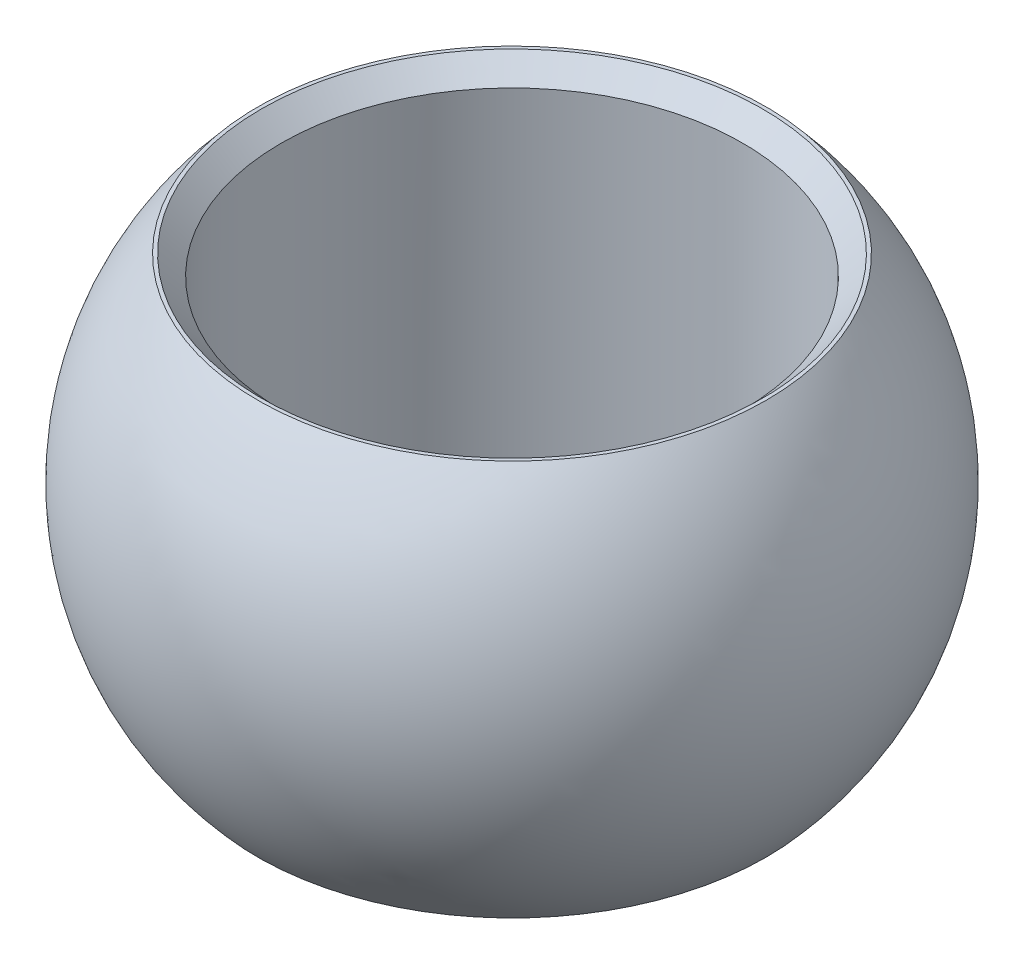
ISO-10303-21;
HEADER;
FILE_DESCRIPTION(('STEP AP214'),'2;1');
FILE_NAME('part.step','',(''),(''),'','','');
FILE_SCHEMA(('AUTOMOTIVE_DESIGN { 1 0 10303 214 1 1 1 1 }'));
ENDSEC;
DATA;
#1=APPLICATION_CONTEXT('core data for automotive mechanical design processes');
#2=APPLICATION_PROTOCOL_DEFINITION('international standard','automotive_design',2000,#1);
#3=PRODUCT_CONTEXT('',#1,'mechanical');
#4=PRODUCT('Part','Part','',(#3));
#5=PRODUCT_RELATED_PRODUCT_CATEGORY('part','',(#4));
#6=PRODUCT_DEFINITION_FORMATION('','',#4);
#7=PRODUCT_DEFINITION_CONTEXT('part definition',#1,'design');
#8=PRODUCT_DEFINITION('design','',#6,#7);
#9=PRODUCT_DEFINITION_SHAPE('','',#8);
#10=(LENGTH_UNIT() NAMED_UNIT(*) SI_UNIT(.MILLI.,.METRE.));
#11=(NAMED_UNIT(*) PLANE_ANGLE_UNIT() SI_UNIT($,.RADIAN.));
#12=(NAMED_UNIT(*) SI_UNIT($,.STERADIAN.) SOLID_ANGLE_UNIT());
#13=UNCERTAINTY_MEASURE_WITH_UNIT(LENGTH_MEASURE(1.E-05),#10,'distance_accuracy_value','');
#14=(GEOMETRIC_REPRESENTATION_CONTEXT(3) GLOBAL_UNCERTAINTY_ASSIGNED_CONTEXT((#13)) GLOBAL_UNIT_ASSIGNED_CONTEXT((#10,
#11,#12)) REPRESENTATION_CONTEXT('',''));
#15=CARTESIAN_POINT('',(0.,0.,0.));
#16=DIRECTION('',(0.,0.,1.));
#17=DIRECTION('',(1.,0.,0.));
#18=AXIS2_PLACEMENT_3D('',#15,#16,#17);
#19=CARTESIAN_POINT('',(17.5,15.,0.));
#20=DIRECTION('',(0.,1.,0.));
#21=DIRECTION('',(-1.,0.,0.));
#22=AXIS2_PLACEMENT_3D('',#19,#20,#21);
#23=PLANE('',#22);
#24=CARTESIAN_POINT('',(0.,14.9999999999999,0.));
#25=DIRECTION('',(0.,1.,0.));
#26=DIRECTION('',(-1.,0.,0.));
#27=AXIS2_PLACEMENT_3D('',#24,#25,#26);
#28=CIRCLE('',#27,19.0000000000002);
#29=CARTESIAN_POINT('',(-19.0000000000003,14.9999999999999,0.));
#30=VERTEX_POINT('',#29);
#31=EDGE_CURVE('E50',#30,#30,#28,.F.);
#32=ORIENTED_EDGE('',*,*,#31,.T.);
#33=EDGE_LOOP('',(#32));
#34=FACE_BOUND('',#33,.T.);
#35=CARTESIAN_POINT('',(0.,14.9999999999998,0.));
#36=DIRECTION('',(0.,-1.,0.));
#37=DIRECTION('',(1.,0.,0.));
#38=AXIS2_PLACEMENT_3D('',#35,#36,#37);
#39=CIRCLE('',#38,19.2705098312485);
#40=CARTESIAN_POINT('',(19.2705098312484,14.9999999999999,0.));
#41=VERTEX_POINT('',#40);
#42=EDGE_CURVE('E55',#41,#41,#39,.T.);
#43=ORIENTED_EDGE('',*,*,#42,.F.);
#44=EDGE_LOOP('',(#43));
#45=FACE_BOUND('',#44,.T.);
#46=ADVANCED_FACE('F34',(#34,#45),#23,.T.);
#47=CARTESIAN_POINT('',(0.,0.,0.));
#48=DIRECTION('',(0.,-1.,0.));
#49=DIRECTION('',(1.,0.,0.));
#50=AXIS2_PLACEMENT_3D('',#47,#48,#49);
#51=DEGENERATE_TOROIDAL_SURFACE('',#50,2.5,22.5,.T.);
#52=ORIENTED_EDGE('',*,*,#42,.T.);
#53=EDGE_LOOP('',(#52));
#54=FACE_BOUND('',#53,.T.);
#55=CARTESIAN_POINT('',(0.,-15.0000000000001,0.));
#56=DIRECTION('',(0.,-1.,0.));
#57=DIRECTION('',(1.,0.,0.));
#58=AXIS2_PLACEMENT_3D('',#55,#56,#57);
#59=CIRCLE('',#58,19.2705098312484);
#60=CARTESIAN_POINT('',(19.2705098312484,-15.,0.));
#61=VERTEX_POINT('',#60);
#62=EDGE_CURVE('E58',#61,#61,#59,.T.);
#63=ORIENTED_EDGE('',*,*,#62,.F.);
#64=EDGE_LOOP('',(#63));
#65=FACE_BOUND('',#64,.T.);
#66=ADVANCED_FACE('F64',(#54,#65),#51,.T.);
#67=CARTESIAN_POINT('',(17.5,-15.,0.));
#68=DIRECTION('',(0.,-1.,0.));
#69=DIRECTION('',(1.,0.,0.));
#70=AXIS2_PLACEMENT_3D('',#67,#68,#69);
#71=PLANE('',#70);
#72=CARTESIAN_POINT('',(0.,-15.0000000000001,0.));
#73=DIRECTION('',(0.,-1.,0.));
#74=DIRECTION('',(1.,0.,0.));
#75=AXIS2_PLACEMENT_3D('',#72,#73,#74);
#76=CIRCLE('',#75,18.9999999999999);
#77=CARTESIAN_POINT('',(19.,-15.,0.));
#78=VERTEX_POINT('',#77);
#79=EDGE_CURVE('E10',#78,#78,#76,.F.);
#80=ORIENTED_EDGE('',*,*,#79,.T.);
#81=EDGE_LOOP('',(#80));
#82=FACE_BOUND('',#81,.T.);
#83=ORIENTED_EDGE('',*,*,#62,.T.);
#84=EDGE_LOOP('',(#83));
#85=FACE_BOUND('',#84,.T.);
#86=ADVANCED_FACE('F62',(#82,#85),#71,.T.);
#87=CARTESIAN_POINT('',(1.69149362820742E-12,-493.111033268098,0.));
#88=DIRECTION('',(0.,-1.,0.));
#89=DIRECTION('',(1.,0.,0.));
#90=AXIS2_PLACEMENT_3D('',#87,#88,#89);
#91=CYLINDRICAL_SURFACE('',#90,17.5);
#92=CARTESIAN_POINT('',(0.,13.4999999999998,0.));
#93=DIRECTION('',(0.,1.,0.));
#94=DIRECTION('',(-1.,0.,0.));
#95=AXIS2_PLACEMENT_3D('',#92,#93,#94);
#96=CIRCLE('',#95,17.5);
#97=CARTESIAN_POINT('',(-17.5,13.4999999999997,0.));
#98=VERTEX_POINT('',#97);
#99=EDGE_CURVE('E42',#98,#98,#96,.T.);
#100=ORIENTED_EDGE('',*,*,#99,.T.);
#101=EDGE_LOOP('',(#100));
#102=FACE_BOUND('',#101,.T.);
#103=CARTESIAN_POINT('',(0.,-13.5000000000002,0.));
#104=DIRECTION('',(0.,-1.,0.));
#105=DIRECTION('',(1.,0.,0.));
#106=AXIS2_PLACEMENT_3D('',#103,#104,#105);
#107=CIRCLE('',#106,17.5);
#108=CARTESIAN_POINT('',(17.5,-13.5000000000001,0.));
#109=VERTEX_POINT('',#108);
#110=EDGE_CURVE('E46',#109,#109,#107,.T.);
#111=ORIENTED_EDGE('',*,*,#110,.T.);
#112=EDGE_LOOP('',(#111));
#113=FACE_BOUND('',#112,.T.);
#114=ADVANCED_FACE('F72',(#102,#113),#91,.F.);
#115=CARTESIAN_POINT('',(0.,14.9999999999998,0.));
#116=DIRECTION('',(0.,1.,0.));
#117=DIRECTION('',(-1.,0.,0.));
#118=AXIS2_PLACEMENT_3D('',#115,#116,#117);
#119=CONICAL_SURFACE('',#118,19.0000000000001,0.785398163397474);
#120=ORIENTED_EDGE('',*,*,#99,.F.);
#121=EDGE_LOOP('',(#120));
#122=FACE_BOUND('',#121,.T.);
#123=ORIENTED_EDGE('',*,*,#31,.F.);
#124=EDGE_LOOP('',(#123));
#125=FACE_BOUND('',#124,.T.);
#126=ADVANCED_FACE('F78',(#122,#125),#119,.F.);
#127=CARTESIAN_POINT('',(0.,-13.5000000000002,0.));
#128=DIRECTION('',(0.,-1.,0.));
#129=DIRECTION('',(1.,0.,0.));
#130=AXIS2_PLACEMENT_3D('',#127,#128,#129);
#131=CONICAL_SURFACE('',#130,17.5,0.785398163397454);
#132=ORIENTED_EDGE('',*,*,#79,.F.);
#133=EDGE_LOOP('',(#132));
#134=FACE_BOUND('',#133,.T.);
#135=ORIENTED_EDGE('',*,*,#110,.F.);
#136=EDGE_LOOP('',(#135));
#137=FACE_BOUND('',#136,.T.);
#138=ADVANCED_FACE('F37',(#134,#137),#131,.F.);
#139=CLOSED_SHELL('',(#46,#66,#86,#114,#126,#138));
#140=MANIFOLD_SOLID_BREP('B2',#139);
#141=ADVANCED_BREP_SHAPE_REPRESENTATION('',(#18,#140),#14);
#142=SHAPE_DEFINITION_REPRESENTATION(#9,#141);
ENDSEC;
END-ISO-10303-21;
